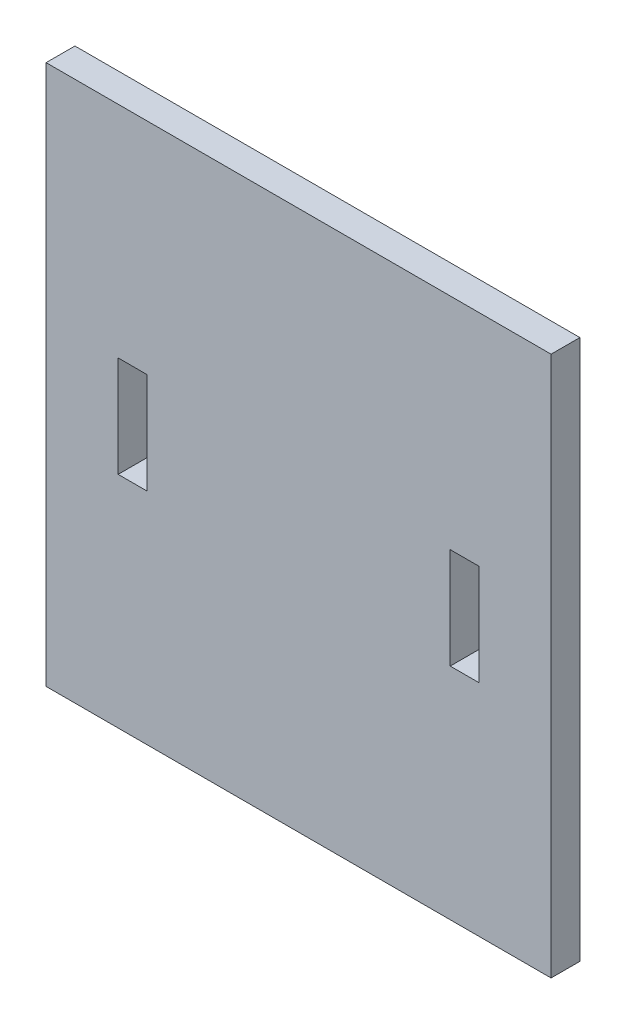
ISO-10303-21;
HEADER;
FILE_DESCRIPTION(('STEP AP214'),'2;1');
FILE_NAME('part.step','',(''),(''),'','','');
FILE_SCHEMA(('AUTOMOTIVE_DESIGN { 1 0 10303 214 1 1 1 1 }'));
ENDSEC;
DATA;
#1=APPLICATION_CONTEXT('core data for automotive mechanical design processes');
#2=APPLICATION_PROTOCOL_DEFINITION('international standard','automotive_design',2000,#1);
#3=PRODUCT_CONTEXT('',#1,'mechanical');
#4=PRODUCT('Part','Part','',(#3));
#5=PRODUCT_RELATED_PRODUCT_CATEGORY('part','',(#4));
#6=PRODUCT_DEFINITION_FORMATION('','',#4);
#7=PRODUCT_DEFINITION_CONTEXT('part definition',#1,'design');
#8=PRODUCT_DEFINITION('design','',#6,#7);
#9=PRODUCT_DEFINITION_SHAPE('','',#8);
#10=(LENGTH_UNIT() NAMED_UNIT(*) SI_UNIT(.MILLI.,.METRE.));
#11=(NAMED_UNIT(*) PLANE_ANGLE_UNIT() SI_UNIT($,.RADIAN.));
#12=(NAMED_UNIT(*) SI_UNIT($,.STERADIAN.) SOLID_ANGLE_UNIT());
#13=UNCERTAINTY_MEASURE_WITH_UNIT(LENGTH_MEASURE(1.E-05),#10,'distance_accuracy_value','');
#14=(GEOMETRIC_REPRESENTATION_CONTEXT(3) GLOBAL_UNCERTAINTY_ASSIGNED_CONTEXT((#13)) GLOBAL_UNIT_ASSIGNED_CONTEXT((#10,
#11,#12)) REPRESENTATION_CONTEXT('',''));
#15=CARTESIAN_POINT('',(0.,0.,0.));
#16=DIRECTION('',(0.,0.,1.));
#17=DIRECTION('',(1.,0.,0.));
#18=AXIS2_PLACEMENT_3D('',#15,#16,#17);
#19=CARTESIAN_POINT('',(-35.05,-37.5,3.99999999999999));
#20=DIRECTION('',(0.,0.,-0.999999999999999));
#21=DIRECTION('',(-1.,0.,0.));
#22=AXIS2_PLACEMENT_3D('',#19,#20,#21);
#23=PLANE('',#22);
#24=DIRECTION('',(0.,-1.,0.));
#25=VECTOR('',#24,1.);
#26=CARTESIAN_POINT('',(21.05,-7.,4.));
#27=LINE('',#26,#25);
#28=CARTESIAN_POINT('',(21.05,7.00000000000002,4.));
#29=VERTEX_POINT('',#28);
#30=CARTESIAN_POINT('',(21.05,-7.,4.));
#31=VERTEX_POINT('',#30);
#32=EDGE_CURVE('E155',#29,#31,#27,.T.);
#33=ORIENTED_EDGE('',*,*,#32,.F.);
#34=DIRECTION('',(-1.,0.,0.));
#35=VECTOR('',#34,1.);
#36=CARTESIAN_POINT('',(21.05,7.00000000000002,4.));
#37=LINE('',#36,#35);
#38=CARTESIAN_POINT('',(25.05,7.00000000000003,4.));
#39=VERTEX_POINT('',#38);
#40=EDGE_CURVE('E163',#39,#29,#37,.T.);
#41=ORIENTED_EDGE('',*,*,#40,.F.);
#42=DIRECTION('',(0.,1.,0.));
#43=VECTOR('',#42,1.);
#44=CARTESIAN_POINT('',(25.05,7.00000000000003,4.));
#45=LINE('',#44,#43);
#46=CARTESIAN_POINT('',(25.05,-6.99999999999999,4.));
#47=VERTEX_POINT('',#46);
#48=EDGE_CURVE('E160',#47,#39,#45,.T.);
#49=ORIENTED_EDGE('',*,*,#48,.F.);
#50=DIRECTION('',(1.,0.,0.));
#51=VECTOR('',#50,1.);
#52=CARTESIAN_POINT('',(25.05,-6.99999999999999,4.));
#53=LINE('',#52,#51);
#54=EDGE_CURVE('E157',#31,#47,#53,.T.);
#55=ORIENTED_EDGE('',*,*,#54,.F.);
#56=EDGE_LOOP('',(#33,#41,#49,#55));
#57=FACE_BOUND('',#56,.T.);
#58=DIRECTION('',(0.,-1.,0.));
#59=VECTOR('',#58,1.);
#60=CARTESIAN_POINT('',(-35.05,37.5,4.00000000000001));
#61=LINE('',#60,#59);
#62=CARTESIAN_POINT('',(-35.05,37.5,4.00000000000001));
#63=VERTEX_POINT('',#62);
#64=CARTESIAN_POINT('',(-35.05,-37.5,3.99999999999999));
#65=VERTEX_POINT('',#64);
#66=EDGE_CURVE('E186',#63,#65,#61,.T.);
#67=ORIENTED_EDGE('',*,*,#66,.T.);
#68=DIRECTION('',(1.,0.,0.));
#69=VECTOR('',#68,1.);
#70=CARTESIAN_POINT('',(35.05,-37.5,3.99999999999999));
#71=LINE('',#70,#69);
#72=CARTESIAN_POINT('',(35.05,-37.5,3.99999999999999));
#73=VERTEX_POINT('',#72);
#74=EDGE_CURVE('E189',#65,#73,#71,.T.);
#75=ORIENTED_EDGE('',*,*,#74,.T.);
#76=DIRECTION('',(0.,1.,0.));
#77=VECTOR('',#76,1.);
#78=CARTESIAN_POINT('',(35.05,37.5,4.00000000000002));
#79=LINE('',#78,#77);
#80=CARTESIAN_POINT('',(35.05,37.5,4.00000000000002));
#81=VERTEX_POINT('',#80);
#82=EDGE_CURVE('E192',#73,#81,#79,.T.);
#83=ORIENTED_EDGE('',*,*,#82,.T.);
#84=DIRECTION('',(-1.,0.,0.));
#85=VECTOR('',#84,1.);
#86=CARTESIAN_POINT('',(35.05,37.5,4.00000000000002));
#87=LINE('',#86,#85);
#88=EDGE_CURVE('E194',#81,#63,#87,.T.);
#89=ORIENTED_EDGE('',*,*,#88,.T.);
#90=EDGE_LOOP('',(#67,#75,#83,#89));
#91=FACE_BOUND('',#90,.T.);
#92=DIRECTION('',(-1.,0.,0.));
#93=VECTOR('',#92,1.);
#94=CARTESIAN_POINT('',(-21.05,7.00000000000001,4.));
#95=LINE('',#94,#93);
#96=CARTESIAN_POINT('',(-21.05,7.00000000000001,4.));
#97=VERTEX_POINT('',#96);
#98=CARTESIAN_POINT('',(-25.05,7.00000000000001,4.));
#99=VERTEX_POINT('',#98);
#100=EDGE_CURVE('E119',#97,#99,#95,.T.);
#101=ORIENTED_EDGE('',*,*,#100,.F.);
#102=DIRECTION('',(0.,1.,0.));
#103=VECTOR('',#102,1.);
#104=CARTESIAN_POINT('',(-21.0499999999999,-7.,4.));
#105=LINE('',#104,#103);
#106=CARTESIAN_POINT('',(-21.0499999999999,-7.,4.));
#107=VERTEX_POINT('',#106);
#108=EDGE_CURVE('E141',#107,#97,#105,.T.);
#109=ORIENTED_EDGE('',*,*,#108,.F.);
#110=DIRECTION('',(1.,0.,0.));
#111=VECTOR('',#110,1.);
#112=CARTESIAN_POINT('',(-25.05,-7.00000000000001,4.));
#113=LINE('',#112,#111);
#114=CARTESIAN_POINT('',(-25.05,-7.00000000000001,4.));
#115=VERTEX_POINT('',#114);
#116=EDGE_CURVE('E139',#115,#107,#113,.T.);
#117=ORIENTED_EDGE('',*,*,#116,.F.);
#118=DIRECTION('',(0.,-1.,0.));
#119=VECTOR('',#118,1.);
#120=CARTESIAN_POINT('',(-25.05,7.00000000000001,4.));
#121=LINE('',#120,#119);
#122=EDGE_CURVE('E127',#99,#115,#121,.T.);
#123=ORIENTED_EDGE('',*,*,#122,.F.);
#124=EDGE_LOOP('',(#101,#109,#117,#123));
#125=FACE_BOUND('',#124,.T.);
#126=ADVANCED_FACE('F30',(#57,#91,#125),#23,.F.);
#127=CARTESIAN_POINT('',(-35.05,-37.5000000000001,0.));
#128=DIRECTION('',(0.,0.,-0.999999999999999));
#129=DIRECTION('',(-1.,0.,0.));
#130=AXIS2_PLACEMENT_3D('',#127,#128,#129);
#131=PLANE('',#130);
#132=DIRECTION('',(-1.,0.,0.));
#133=VECTOR('',#132,1.);
#134=CARTESIAN_POINT('',(21.05,7.00000000000002,0.));
#135=LINE('',#134,#133);
#136=CARTESIAN_POINT('',(25.05,7.00000000000002,0.));
#137=VERTEX_POINT('',#136);
#138=CARTESIAN_POINT('',(21.05,7.00000000000002,0.));
#139=VERTEX_POINT('',#138);
#140=EDGE_CURVE('E158',#137,#139,#135,.T.);
#141=ORIENTED_EDGE('',*,*,#140,.T.);
#142=DIRECTION('',(0.,-1.,0.));
#143=VECTOR('',#142,1.);
#144=CARTESIAN_POINT('',(21.05,-6.99999999999999,0.));
#145=LINE('',#144,#143);
#146=CARTESIAN_POINT('',(21.05,-6.99999999999999,0.));
#147=VERTEX_POINT('',#146);
#148=EDGE_CURVE('E135',#139,#147,#145,.T.);
#149=ORIENTED_EDGE('',*,*,#148,.T.);
#150=DIRECTION('',(1.,0.,0.));
#151=VECTOR('',#150,1.);
#152=CARTESIAN_POINT('',(25.05,-6.99999999999999,0.));
#153=LINE('',#152,#151);
#154=CARTESIAN_POINT('',(25.05,-6.99999999999999,0.));
#155=VERTEX_POINT('',#154);
#156=EDGE_CURVE('E168',#147,#155,#153,.T.);
#157=ORIENTED_EDGE('',*,*,#156,.T.);
#158=DIRECTION('',(0.,1.,0.));
#159=VECTOR('',#158,1.);
#160=CARTESIAN_POINT('',(25.05,7.00000000000002,0.));
#161=LINE('',#160,#159);
#162=EDGE_CURVE('E171',#155,#137,#161,.T.);
#163=ORIENTED_EDGE('',*,*,#162,.T.);
#164=EDGE_LOOP('',(#141,#149,#157,#163));
#165=FACE_BOUND('',#164,.T.);
#166=DIRECTION('',(0.,-1.,0.));
#167=VECTOR('',#166,1.);
#168=CARTESIAN_POINT('',(-35.0499999999999,37.5,0.));
#169=LINE('',#168,#167);
#170=CARTESIAN_POINT('',(-35.0499999999999,37.5,0.));
#171=VERTEX_POINT('',#170);
#172=CARTESIAN_POINT('',(-35.05,-37.5000000000001,0.));
#173=VERTEX_POINT('',#172);
#174=EDGE_CURVE('E185',#171,#173,#169,.T.);
#175=ORIENTED_EDGE('',*,*,#174,.F.);
#176=DIRECTION('',(-1.,0.,0.));
#177=VECTOR('',#176,1.);
#178=CARTESIAN_POINT('',(35.05,37.5000000000001,0.));
#179=LINE('',#178,#177);
#180=CARTESIAN_POINT('',(35.05,37.5000000000001,0.));
#181=VERTEX_POINT('',#180);
#182=EDGE_CURVE('E190',#181,#171,#179,.T.);
#183=ORIENTED_EDGE('',*,*,#182,.F.);
#184=DIRECTION('',(0.,1.,0.));
#185=VECTOR('',#184,1.);
#186=CARTESIAN_POINT('',(35.05,37.5000000000001,0.));
#187=LINE('',#186,#185);
#188=CARTESIAN_POINT('',(35.05,-37.5,0.));
#189=VERTEX_POINT('',#188);
#190=EDGE_CURVE('E201',#189,#181,#187,.T.);
#191=ORIENTED_EDGE('',*,*,#190,.F.);
#192=DIRECTION('',(1.,0.,0.));
#193=VECTOR('',#192,1.);
#194=CARTESIAN_POINT('',(35.05,-37.5,0.));
#195=LINE('',#194,#193);
#196=EDGE_CURVE('E199',#173,#189,#195,.T.);
#197=ORIENTED_EDGE('',*,*,#196,.F.);
#198=EDGE_LOOP('',(#175,#183,#191,#197));
#199=FACE_BOUND('',#198,.T.);
#200=DIRECTION('',(0.,1.,0.));
#201=VECTOR('',#200,1.);
#202=CARTESIAN_POINT('',(-21.05,-7.00000000000001,0.));
#203=LINE('',#202,#201);
#204=CARTESIAN_POINT('',(-21.05,-7.00000000000001,0.));
#205=VERTEX_POINT('',#204);
#206=CARTESIAN_POINT('',(-21.05,7.,0.));
#207=VERTEX_POINT('',#206);
#208=EDGE_CURVE('E128',#205,#207,#203,.T.);
#209=ORIENTED_EDGE('',*,*,#208,.T.);
#210=DIRECTION('',(-1.,0.,0.));
#211=VECTOR('',#210,1.);
#212=CARTESIAN_POINT('',(-21.05,7.00000000000001,0.));
#213=LINE('',#212,#211);
#214=CARTESIAN_POINT('',(-25.05,7.,0.));
#215=VERTEX_POINT('',#214);
#216=EDGE_CURVE('E53',#207,#215,#213,.T.);
#217=ORIENTED_EDGE('',*,*,#216,.T.);
#218=DIRECTION('',(0.,-1.,0.));
#219=VECTOR('',#218,1.);
#220=CARTESIAN_POINT('',(-25.05,7.,0.));
#221=LINE('',#220,#219);
#222=CARTESIAN_POINT('',(-25.05,-7.,0.));
#223=VERTEX_POINT('',#222);
#224=EDGE_CURVE('E134',#215,#223,#221,.T.);
#225=ORIENTED_EDGE('',*,*,#224,.T.);
#226=DIRECTION('',(1.,0.,0.));
#227=VECTOR('',#226,1.);
#228=CARTESIAN_POINT('',(-25.05,-7.,0.));
#229=LINE('',#228,#227);
#230=EDGE_CURVE('E147',#223,#205,#229,.T.);
#231=ORIENTED_EDGE('',*,*,#230,.T.);
#232=EDGE_LOOP('',(#209,#217,#225,#231));
#233=FACE_BOUND('',#232,.T.);
#234=ADVANCED_FACE('F219',(#165,#199,#233),#131,.T.);
#235=CARTESIAN_POINT('',(-35.05,37.5,4.00000000000001));
#236=DIRECTION('',(1.,0.,0.));
#237=DIRECTION('',(0.,1.,0.));
#238=AXIS2_PLACEMENT_3D('',#235,#236,#237);
#239=PLANE('',#238);
#240=ORIENTED_EDGE('',*,*,#174,.T.);
#241=DIRECTION('',(0.,0.,-0.999999999999999));
#242=VECTOR('',#241,1.);
#243=CARTESIAN_POINT('',(-35.05,-37.5,3.99999999999999));
#244=LINE('',#243,#242);
#245=EDGE_CURVE('E11',#65,#173,#244,.T.);
#246=ORIENTED_EDGE('',*,*,#245,.F.);
#247=ORIENTED_EDGE('',*,*,#66,.F.);
#248=DIRECTION('',(0.,0.,-0.999999999999999));
#249=VECTOR('',#248,1.);
#250=CARTESIAN_POINT('',(-35.05,37.5,4.00000000000001));
#251=LINE('',#250,#249);
#252=EDGE_CURVE('E196',#63,#171,#251,.T.);
#253=ORIENTED_EDGE('',*,*,#252,.T.);
#254=EDGE_LOOP('',(#240,#246,#247,#253));
#255=FACE_BOUND('',#254,.T.);
#256=ADVANCED_FACE('F32',(#255),#239,.F.);
#257=CARTESIAN_POINT('',(35.05,-37.5,3.99999999999999));
#258=DIRECTION('',(0.,1.,0.));
#259=DIRECTION('',(-1.,0.,0.));
#260=AXIS2_PLACEMENT_3D('',#257,#258,#259);
#261=PLANE('',#260);
#262=ORIENTED_EDGE('',*,*,#196,.T.);
#263=DIRECTION('',(0.,0.,-0.999999999999999));
#264=VECTOR('',#263,1.);
#265=CARTESIAN_POINT('',(35.05,-37.5,3.99999999999999));
#266=LINE('',#265,#264);
#267=EDGE_CURVE('E38',#73,#189,#266,.T.);
#268=ORIENTED_EDGE('',*,*,#267,.F.);
#269=ORIENTED_EDGE('',*,*,#74,.F.);
#270=ORIENTED_EDGE('',*,*,#245,.T.);
#271=EDGE_LOOP('',(#262,#268,#269,#270));
#272=FACE_BOUND('',#271,.T.);
#273=ADVANCED_FACE('F229',(#272),#261,.F.);
#274=CARTESIAN_POINT('',(35.05,37.5,4.00000000000002));
#275=DIRECTION('',(-1.,0.,0.));
#276=DIRECTION('',(0.,-1.,0.));
#277=AXIS2_PLACEMENT_3D('',#274,#275,#276);
#278=PLANE('',#277);
#279=ORIENTED_EDGE('',*,*,#190,.T.);
#280=DIRECTION('',(0.,0.,-0.999999999999999));
#281=VECTOR('',#280,1.);
#282=CARTESIAN_POINT('',(35.05,37.5,4.00000000000002));
#283=LINE('',#282,#281);
#284=EDGE_CURVE('E206',#81,#181,#283,.T.);
#285=ORIENTED_EDGE('',*,*,#284,.F.);
#286=ORIENTED_EDGE('',*,*,#82,.F.);
#287=ORIENTED_EDGE('',*,*,#267,.T.);
#288=EDGE_LOOP('',(#279,#285,#286,#287));
#289=FACE_BOUND('',#288,.T.);
#290=ADVANCED_FACE('F213',(#289),#278,.F.);
#291=CARTESIAN_POINT('',(35.05,37.5,4.00000000000002));
#292=DIRECTION('',(0.,-1.,0.));
#293=DIRECTION('',(1.,0.,0.));
#294=AXIS2_PLACEMENT_3D('',#291,#292,#293);
#295=PLANE('',#294);
#296=ORIENTED_EDGE('',*,*,#182,.T.);
#297=ORIENTED_EDGE('',*,*,#252,.F.);
#298=ORIENTED_EDGE('',*,*,#88,.F.);
#299=ORIENTED_EDGE('',*,*,#284,.T.);
#300=EDGE_LOOP('',(#296,#297,#298,#299));
#301=FACE_BOUND('',#300,.T.);
#302=ADVANCED_FACE('F223',(#301),#295,.F.);
#303=CARTESIAN_POINT('',(21.05,-7.,4.));
#304=DIRECTION('',(1.,0.,0.));
#305=DIRECTION('',(0.,0.,-0.999999999999999));
#306=AXIS2_PLACEMENT_3D('',#303,#304,#305);
#307=PLANE('',#306);
#308=ORIENTED_EDGE('',*,*,#148,.F.);
#309=DIRECTION('',(0.,0.,-0.999999999999999));
#310=VECTOR('',#309,1.);
#311=CARTESIAN_POINT('',(21.05,7.00000000000002,4.));
#312=LINE('',#311,#310);
#313=EDGE_CURVE('E165',#29,#139,#312,.T.);
#314=ORIENTED_EDGE('',*,*,#313,.F.);
#315=ORIENTED_EDGE('',*,*,#32,.T.);
#316=DIRECTION('',(0.,0.,-0.999999999999999));
#317=VECTOR('',#316,1.);
#318=CARTESIAN_POINT('',(21.05,-7.,4.));
#319=LINE('',#318,#317);
#320=EDGE_CURVE('E182',#31,#147,#319,.T.);
#321=ORIENTED_EDGE('',*,*,#320,.T.);
#322=EDGE_LOOP('',(#308,#314,#315,#321));
#323=FACE_BOUND('',#322,.T.);
#324=ADVANCED_FACE('F246',(#323),#307,.T.);
#325=CARTESIAN_POINT('',(25.05,-6.99999999999999,4.));
#326=DIRECTION('',(0.,1.,0.));
#327=DIRECTION('',(0.,0.,0.999999999999999));
#328=AXIS2_PLACEMENT_3D('',#325,#326,#327);
#329=PLANE('',#328);
#330=ORIENTED_EDGE('',*,*,#156,.F.);
#331=ORIENTED_EDGE('',*,*,#320,.F.);
#332=ORIENTED_EDGE('',*,*,#54,.T.);
#333=DIRECTION('',(0.,0.,-0.999999999999999));
#334=VECTOR('',#333,1.);
#335=CARTESIAN_POINT('',(25.05,-6.99999999999999,4.));
#336=LINE('',#335,#334);
#337=EDGE_CURVE('E180',#47,#155,#336,.T.);
#338=ORIENTED_EDGE('',*,*,#337,.T.);
#339=EDGE_LOOP('',(#330,#331,#332,#338));
#340=FACE_BOUND('',#339,.T.);
#341=ADVANCED_FACE('F253',(#340),#329,.T.);
#342=CARTESIAN_POINT('',(25.05,7.00000000000003,4.));
#343=DIRECTION('',(-1.,0.,0.));
#344=DIRECTION('',(0.,0.,0.999999999999999));
#345=AXIS2_PLACEMENT_3D('',#342,#343,#344);
#346=PLANE('',#345);
#347=ORIENTED_EDGE('',*,*,#162,.F.);
#348=ORIENTED_EDGE('',*,*,#337,.F.);
#349=ORIENTED_EDGE('',*,*,#48,.T.);
#350=DIRECTION('',(0.,0.,-0.999999999999999));
#351=VECTOR('',#350,1.);
#352=CARTESIAN_POINT('',(25.05,7.00000000000003,4.));
#353=LINE('',#352,#351);
#354=EDGE_CURVE('E178',#39,#137,#353,.T.);
#355=ORIENTED_EDGE('',*,*,#354,.T.);
#356=EDGE_LOOP('',(#347,#348,#349,#355));
#357=FACE_BOUND('',#356,.T.);
#358=ADVANCED_FACE('F258',(#357),#346,.T.);
#359=CARTESIAN_POINT('',(21.05,7.00000000000002,4.));
#360=DIRECTION('',(0.,-1.,0.));
#361=DIRECTION('',(1.,0.,0.));
#362=AXIS2_PLACEMENT_3D('',#359,#360,#361);
#363=PLANE('',#362);
#364=ORIENTED_EDGE('',*,*,#140,.F.);
#365=ORIENTED_EDGE('',*,*,#354,.F.);
#366=ORIENTED_EDGE('',*,*,#40,.T.);
#367=ORIENTED_EDGE('',*,*,#313,.T.);
#368=EDGE_LOOP('',(#364,#365,#366,#367));
#369=FACE_BOUND('',#368,.T.);
#370=ADVANCED_FACE('F264',(#369),#363,.T.);
#371=CARTESIAN_POINT('',(-21.05,7.00000000000001,4.));
#372=DIRECTION('',(0.,-1.,0.));
#373=DIRECTION('',(1.,0.,0.));
#374=AXIS2_PLACEMENT_3D('',#371,#372,#373);
#375=PLANE('',#374);
#376=ORIENTED_EDGE('',*,*,#216,.F.);
#377=DIRECTION('',(0.,0.,-0.999999999999999));
#378=VECTOR('',#377,1.);
#379=CARTESIAN_POINT('',(-21.05,7.00000000000001,4.));
#380=LINE('',#379,#378);
#381=EDGE_CURVE('E123',#97,#207,#380,.T.);
#382=ORIENTED_EDGE('',*,*,#381,.F.);
#383=ORIENTED_EDGE('',*,*,#100,.T.);
#384=DIRECTION('',(0.,0.,-0.999999999999999));
#385=VECTOR('',#384,1.);
#386=CARTESIAN_POINT('',(-25.05,7.00000000000001,4.));
#387=LINE('',#386,#385);
#388=EDGE_CURVE('E122',#99,#215,#387,.T.);
#389=ORIENTED_EDGE('',*,*,#388,.T.);
#390=EDGE_LOOP('',(#376,#382,#383,#389));
#391=FACE_BOUND('',#390,.T.);
#392=ADVANCED_FACE('F121',(#391),#375,.T.);
#393=CARTESIAN_POINT('',(-25.05,7.00000000000001,4.));
#394=DIRECTION('',(1.,0.,0.));
#395=DIRECTION('',(0.,0.,-0.999999999999999));
#396=AXIS2_PLACEMENT_3D('',#393,#394,#395);
#397=PLANE('',#396);
#398=ORIENTED_EDGE('',*,*,#224,.F.);
#399=ORIENTED_EDGE('',*,*,#388,.F.);
#400=ORIENTED_EDGE('',*,*,#122,.T.);
#401=DIRECTION('',(0.,0.,-0.999999999999999));
#402=VECTOR('',#401,1.);
#403=CARTESIAN_POINT('',(-25.05,-7.00000000000001,4.));
#404=LINE('',#403,#402);
#405=EDGE_CURVE('E136',#115,#223,#404,.T.);
#406=ORIENTED_EDGE('',*,*,#405,.T.);
#407=EDGE_LOOP('',(#398,#399,#400,#406));
#408=FACE_BOUND('',#407,.T.);
#409=ADVANCED_FACE('F131',(#408),#397,.T.);
#410=CARTESIAN_POINT('',(-25.05,-7.00000000000001,4.));
#411=DIRECTION('',(0.,1.,0.));
#412=DIRECTION('',(0.,0.,0.999999999999999));
#413=AXIS2_PLACEMENT_3D('',#410,#411,#412);
#414=PLANE('',#413);
#415=ORIENTED_EDGE('',*,*,#230,.F.);
#416=ORIENTED_EDGE('',*,*,#405,.F.);
#417=ORIENTED_EDGE('',*,*,#116,.T.);
#418=DIRECTION('',(0.,0.,-0.999999999999999));
#419=VECTOR('',#418,1.);
#420=CARTESIAN_POINT('',(-21.0499999999999,-7.,4.));
#421=LINE('',#420,#419);
#422=EDGE_CURVE('E45',#107,#205,#421,.T.);
#423=ORIENTED_EDGE('',*,*,#422,.T.);
#424=EDGE_LOOP('',(#415,#416,#417,#423));
#425=FACE_BOUND('',#424,.T.);
#426=ADVANCED_FACE('F282',(#425),#414,.T.);
#427=CARTESIAN_POINT('',(-21.0499999999999,-7.,4.));
#428=DIRECTION('',(-1.,0.,0.));
#429=DIRECTION('',(0.,0.,0.999999999999999));
#430=AXIS2_PLACEMENT_3D('',#427,#428,#429);
#431=PLANE('',#430);
#432=ORIENTED_EDGE('',*,*,#208,.F.);
#433=ORIENTED_EDGE('',*,*,#422,.F.);
#434=ORIENTED_EDGE('',*,*,#108,.T.);
#435=ORIENTED_EDGE('',*,*,#381,.T.);
#436=EDGE_LOOP('',(#432,#433,#434,#435));
#437=FACE_BOUND('',#436,.T.);
#438=ADVANCED_FACE('F285',(#437),#431,.T.);
#439=CLOSED_SHELL('',(#126,#234,#256,#273,#290,#302,#324,#341,#358,#370,#392,#409,#426,#438));
#440=MANIFOLD_SOLID_BREP('B2',#439);
#441=ADVANCED_BREP_SHAPE_REPRESENTATION('',(#18,#440),#14);
#442=SHAPE_DEFINITION_REPRESENTATION(#9,#441);
ENDSEC;
END-ISO-10303-21;
